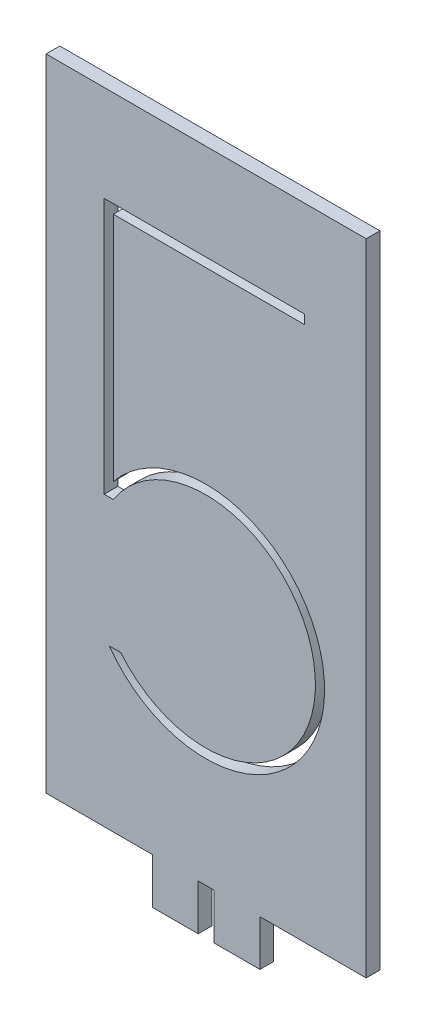
ISO-10303-21;
HEADER;
FILE_DESCRIPTION(('STEP AP214'),'2;1');
FILE_NAME('part.step','',(''),(''),'','','');
FILE_SCHEMA(('AUTOMOTIVE_DESIGN { 1 0 10303 214 1 1 1 1 }'));
ENDSEC;
DATA;
#1=APPLICATION_CONTEXT('core data for automotive mechanical design processes');
#2=APPLICATION_PROTOCOL_DEFINITION('international standard','automotive_design',2000,#1);
#3=PRODUCT_CONTEXT('',#1,'mechanical');
#4=PRODUCT('Part','Part','',(#3));
#5=PRODUCT_RELATED_PRODUCT_CATEGORY('part','',(#4));
#6=PRODUCT_DEFINITION_FORMATION('','',#4);
#7=PRODUCT_DEFINITION_CONTEXT('part definition',#1,'design');
#8=PRODUCT_DEFINITION('design','',#6,#7);
#9=PRODUCT_DEFINITION_SHAPE('','',#8);
#10=(LENGTH_UNIT() NAMED_UNIT(*) SI_UNIT(.MILLI.,.METRE.));
#11=(NAMED_UNIT(*) PLANE_ANGLE_UNIT() SI_UNIT($,.RADIAN.));
#12=(NAMED_UNIT(*) SI_UNIT($,.STERADIAN.) SOLID_ANGLE_UNIT());
#13=UNCERTAINTY_MEASURE_WITH_UNIT(LENGTH_MEASURE(1.E-05),#10,'distance_accuracy_value','');
#14=(GEOMETRIC_REPRESENTATION_CONTEXT(3) GLOBAL_UNCERTAINTY_ASSIGNED_CONTEXT((#13)) GLOBAL_UNIT_ASSIGNED_CONTEXT((#10,
#11,#12)) REPRESENTATION_CONTEXT('',''));
#15=CARTESIAN_POINT('',(0.,0.,0.));
#16=DIRECTION('',(0.,0.,1.));
#17=DIRECTION('',(1.,0.,0.));
#18=AXIS2_PLACEMENT_3D('',#15,#16,#17);
#19=CARTESIAN_POINT('',(0.,0.,1.5));
#20=DIRECTION('',(0.,1.,0.));
#21=DIRECTION('',(0.,0.,1.));
#22=AXIS2_PLACEMENT_3D('',#19,#20,#21);
#23=PLANE('',#22);
#24=DIRECTION('',(1.,0.,0.));
#25=VECTOR('',#24,1.);
#26=CARTESIAN_POINT('',(0.,0.,1.5));
#27=LINE('',#26,#25);
#28=CARTESIAN_POINT('',(11.63,0.,1.5));
#29=VERTEX_POINT('',#28);
#30=CARTESIAN_POINT('',(16.63,0.,1.5));
#31=VERTEX_POINT('',#30);
#32=EDGE_CURVE('E362',#29,#31,#27,.T.);
#33=ORIENTED_EDGE('',*,*,#32,.F.);
#34=DIRECTION('',(0.,0.,1.));
#35=VECTOR('',#34,1.);
#36=CARTESIAN_POINT('',(11.63,0.,0.));
#37=LINE('',#36,#35);
#38=CARTESIAN_POINT('',(11.63,0.,0.));
#39=VERTEX_POINT('',#38);
#40=EDGE_CURVE('E278',#39,#29,#37,.T.);
#41=ORIENTED_EDGE('',*,*,#40,.F.);
#42=DIRECTION('',(1.,0.,0.));
#43=VECTOR('',#42,1.);
#44=CARTESIAN_POINT('',(0.,0.,0.));
#45=LINE('',#44,#43);
#46=CARTESIAN_POINT('',(16.63,0.,0.));
#47=VERTEX_POINT('',#46);
#48=EDGE_CURVE('E377',#39,#47,#45,.T.);
#49=ORIENTED_EDGE('',*,*,#48,.T.);
#50=DIRECTION('',(0.,0.,1.));
#51=VECTOR('',#50,1.);
#52=CARTESIAN_POINT('',(16.63,0.,0.));
#53=LINE('',#52,#51);
#54=EDGE_CURVE('E332',#47,#31,#53,.T.);
#55=ORIENTED_EDGE('',*,*,#54,.T.);
#56=EDGE_LOOP('',(#33,#41,#49,#55));
#57=FACE_BOUND('',#56,.T.);
#58=ADVANCED_FACE('F39',(#57),#23,.F.);
#59=CARTESIAN_POINT('',(0.,0.,1.5));
#60=DIRECTION('',(1.,0.,0.));
#61=DIRECTION('',(0.,1.,0.));
#62=AXIS2_PLACEMENT_3D('',#59,#60,#61);
#63=PLANE('',#62);
#64=DIRECTION('',(0.,-1.,0.));
#65=VECTOR('',#64,1.);
#66=CARTESIAN_POINT('',(0.,0.,0.));
#67=LINE('',#66,#65);
#68=CARTESIAN_POINT('',(0.,75.,0.));
#69=VERTEX_POINT('',#68);
#70=CARTESIAN_POINT('',(0.,5.,0.));
#71=VERTEX_POINT('',#70);
#72=EDGE_CURVE('E290',#69,#71,#67,.T.);
#73=ORIENTED_EDGE('',*,*,#72,.T.);
#74=DIRECTION('',(0.,0.,1.));
#75=VECTOR('',#74,1.);
#76=CARTESIAN_POINT('',(0.,5.,0.));
#77=LINE('',#76,#75);
#78=CARTESIAN_POINT('',(0.,5.,1.5));
#79=VERTEX_POINT('',#78);
#80=EDGE_CURVE('E286',#71,#79,#77,.T.);
#81=ORIENTED_EDGE('',*,*,#80,.T.);
#82=DIRECTION('',(0.,-1.,0.));
#83=VECTOR('',#82,1.);
#84=CARTESIAN_POINT('',(0.,0.,1.5));
#85=LINE('',#84,#83);
#86=CARTESIAN_POINT('',(0.,75.,1.5));
#87=VERTEX_POINT('',#86);
#88=EDGE_CURVE('E353',#87,#79,#85,.T.);
#89=ORIENTED_EDGE('',*,*,#88,.F.);
#90=DIRECTION('',(0.,0.,-1.));
#91=VECTOR('',#90,1.);
#92=CARTESIAN_POINT('',(0.,75.,1.5));
#93=LINE('',#92,#91);
#94=EDGE_CURVE('E369',#87,#69,#93,.T.);
#95=ORIENTED_EDGE('',*,*,#94,.T.);
#96=EDGE_LOOP('',(#73,#81,#89,#95));
#97=FACE_BOUND('',#96,.T.);
#98=ADVANCED_FACE('F41',(#97),#63,.F.);
#99=CARTESIAN_POINT('',(18.38,0.,0.));
#100=VERTEX_POINT('',#99);
#101=CARTESIAN_POINT('',(23.38,0.,0.));
#102=VERTEX_POINT('',#101);
#103=EDGE_CURVE('E373',#100,#102,#45,.T.);
#104=ORIENTED_EDGE('',*,*,#103,.T.);
#105=DIRECTION('',(0.,0.,1.));
#106=VECTOR('',#105,1.);
#107=CARTESIAN_POINT('',(23.38,0.,0.));
#108=LINE('',#107,#106);
#109=CARTESIAN_POINT('',(23.38,0.,1.5));
#110=VERTEX_POINT('',#109);
#111=EDGE_CURVE('E303',#102,#110,#108,.T.);
#112=ORIENTED_EDGE('',*,*,#111,.T.);
#113=CARTESIAN_POINT('',(18.38,0.,1.5));
#114=VERTEX_POINT('',#113);
#115=EDGE_CURVE('E357',#114,#110,#27,.T.);
#116=ORIENTED_EDGE('',*,*,#115,.F.);
#117=DIRECTION('',(0.,0.,1.));
#118=VECTOR('',#117,1.);
#119=CARTESIAN_POINT('',(18.38,0.,0.));
#120=LINE('',#119,#118);
#121=EDGE_CURVE('E347',#100,#114,#120,.T.);
#122=ORIENTED_EDGE('',*,*,#121,.F.);
#123=EDGE_LOOP('',(#104,#112,#116,#122));
#124=FACE_BOUND('',#123,.T.);
#125=ADVANCED_FACE('F446',(#124),#23,.F.);
#126=CARTESIAN_POINT('',(35.,0.,1.5));
#127=DIRECTION('',(-1.,0.,0.));
#128=DIRECTION('',(0.,-1.,0.));
#129=AXIS2_PLACEMENT_3D('',#126,#127,#128);
#130=PLANE('',#129);
#131=DIRECTION('',(0.,1.,0.));
#132=VECTOR('',#131,1.);
#133=CARTESIAN_POINT('',(35.,0.,1.5));
#134=LINE('',#133,#132);
#135=CARTESIAN_POINT('',(35.,5.,1.5));
#136=VERTEX_POINT('',#135);
#137=CARTESIAN_POINT('',(35.,75.,1.5));
#138=VERTEX_POINT('',#137);
#139=EDGE_CURVE('E363',#136,#138,#134,.T.);
#140=ORIENTED_EDGE('',*,*,#139,.F.);
#141=DIRECTION('',(0.,0.,1.));
#142=VECTOR('',#141,1.);
#143=CARTESIAN_POINT('',(35.,5.,0.));
#144=LINE('',#143,#142);
#145=CARTESIAN_POINT('',(35.,5.,0.));
#146=VERTEX_POINT('',#145);
#147=EDGE_CURVE('E313',#146,#136,#144,.T.);
#148=ORIENTED_EDGE('',*,*,#147,.F.);
#149=DIRECTION('',(0.,1.,0.));
#150=VECTOR('',#149,1.);
#151=CARTESIAN_POINT('',(35.,0.,0.));
#152=LINE('',#151,#150);
#153=CARTESIAN_POINT('',(35.,75.,0.));
#154=VERTEX_POINT('',#153);
#155=EDGE_CURVE('E378',#146,#154,#152,.T.);
#156=ORIENTED_EDGE('',*,*,#155,.T.);
#157=DIRECTION('',(0.,0.,-1.));
#158=VECTOR('',#157,1.);
#159=CARTESIAN_POINT('',(35.,75.,1.5));
#160=LINE('',#159,#158);
#161=EDGE_CURVE('E386',#138,#154,#160,.T.);
#162=ORIENTED_EDGE('',*,*,#161,.F.);
#163=EDGE_LOOP('',(#140,#148,#156,#162));
#164=FACE_BOUND('',#163,.T.);
#165=ADVANCED_FACE('F454',(#164),#130,.F.);
#166=CARTESIAN_POINT('',(0.,75.,1.5));
#167=DIRECTION('',(0.,-1.,0.));
#168=DIRECTION('',(0.,0.,-1.));
#169=AXIS2_PLACEMENT_3D('',#166,#167,#168);
#170=PLANE('',#169);
#171=DIRECTION('',(-1.,0.,0.));
#172=VECTOR('',#171,1.);
#173=CARTESIAN_POINT('',(0.,75.,0.));
#174=LINE('',#173,#172);
#175=EDGE_CURVE('E358',#154,#69,#174,.T.);
#176=ORIENTED_EDGE('',*,*,#175,.T.);
#177=ORIENTED_EDGE('',*,*,#94,.F.);
#178=DIRECTION('',(-1.,0.,0.));
#179=VECTOR('',#178,1.);
#180=CARTESIAN_POINT('',(0.,75.,1.5));
#181=LINE('',#180,#179);
#182=EDGE_CURVE('E366',#138,#87,#181,.T.);
#183=ORIENTED_EDGE('',*,*,#182,.F.);
#184=ORIENTED_EDGE('',*,*,#161,.T.);
#185=EDGE_LOOP('',(#176,#177,#183,#184));
#186=FACE_BOUND('',#185,.T.);
#187=ADVANCED_FACE('F459',(#186),#170,.F.);
#188=CARTESIAN_POINT('',(0.,0.,1.5));
#189=DIRECTION('',(0.,0.,-1.));
#190=DIRECTION('',(-1.,0.,0.));
#191=AXIS2_PLACEMENT_3D('',#188,#189,#190);
#192=PLANE('',#191);
#193=DIRECTION('',(1.,0.,0.));
#194=VECTOR('',#193,1.);
#195=CARTESIAN_POINT('',(7.35039959030423,63.5,1.5));
#196=LINE('',#195,#194);
#197=CARTESIAN_POINT('',(7.35039959030423,63.5,1.5));
#198=VERTEX_POINT('',#197);
#199=CARTESIAN_POINT('',(28.25,63.5,1.5));
#200=VERTEX_POINT('',#199);
#201=EDGE_CURVE('E187',#198,#200,#196,.T.);
#202=ORIENTED_EDGE('',*,*,#201,.F.);
#203=DIRECTION('',(0.,1.,0.));
#204=VECTOR('',#203,1.);
#205=CARTESIAN_POINT('',(7.35039959030423,36.4826841073414,1.5));
#206=LINE('',#205,#204);
#207=CARTESIAN_POINT('',(7.35039959030423,38.1868915490299,1.5));
#208=VERTEX_POINT('',#207);
#209=EDGE_CURVE('E198',#208,#198,#206,.T.);
#210=ORIENTED_EDGE('',*,*,#209,.F.);
#211=CARTESIAN_POINT('',(17.4486572006261,30.,1.5));
#212=DIRECTION('',(0.,0.,1.));
#213=DIRECTION('',(1.,0.,0.));
#214=AXIS2_PLACEMENT_3D('',#211,#212,#213);
#215=CIRCLE('',#214,13.);
#216=CARTESIAN_POINT('',(6.90262565731402,22.3986041619011,1.5));
#217=VERTEX_POINT('',#216);
#218=EDGE_CURVE('E249',#217,#208,#215,.T.);
#219=ORIENTED_EDGE('',*,*,#218,.F.);
#220=DIRECTION('',(-1.,0.,0.));
#221=VECTOR('',#220,1.);
#222=CARTESIAN_POINT('',(8.16325029987407,22.3986041619011,1.5));
#223=LINE('',#222,#221);
#224=CARTESIAN_POINT('',(8.16325029987407,22.3986041619011,1.5));
#225=VERTEX_POINT('',#224);
#226=EDGE_CURVE('E256',#225,#217,#223,.T.);
#227=ORIENTED_EDGE('',*,*,#226,.F.);
#228=CARTESIAN_POINT('',(17.4486572006261,30.,1.5));
#229=DIRECTION('',(0.,0.,-1.));
#230=DIRECTION('',(1.,0.,0.));
#231=AXIS2_PLACEMENT_3D('',#228,#229,#230);
#232=CIRCLE('',#231,12.);
#233=CARTESIAN_POINT('',(7.35039959030423,36.4826841073414,1.5));
#234=VERTEX_POINT('',#233);
#235=EDGE_CURVE('E252',#234,#225,#232,.T.);
#236=ORIENTED_EDGE('',*,*,#235,.F.);
#237=DIRECTION('',(1.,0.,0.));
#238=VECTOR('',#237,1.);
#239=CARTESIAN_POINT('',(7.35039959030423,36.4826841073414,1.5));
#240=LINE('',#239,#238);
#241=CARTESIAN_POINT('',(6.35039959030423,36.4826841073414,1.5));
#242=VERTEX_POINT('',#241);
#243=EDGE_CURVE('E195',#242,#234,#240,.T.);
#244=ORIENTED_EDGE('',*,*,#243,.F.);
#245=DIRECTION('',(0.,-1.,0.));
#246=VECTOR('',#245,1.);
#247=CARTESIAN_POINT('',(6.35039959030423,36.4826841073414,1.5));
#248=LINE('',#247,#246);
#249=CARTESIAN_POINT('',(6.35039959030423,64.5,1.5));
#250=VERTEX_POINT('',#249);
#251=EDGE_CURVE('E221',#250,#242,#248,.T.);
#252=ORIENTED_EDGE('',*,*,#251,.F.);
#253=DIRECTION('',(-1.,0.,0.));
#254=VECTOR('',#253,1.);
#255=CARTESIAN_POINT('',(7.35039959030423,64.5,1.5));
#256=LINE('',#255,#254);
#257=CARTESIAN_POINT('',(28.25,64.5,1.5));
#258=VERTEX_POINT('',#257);
#259=EDGE_CURVE('E215',#258,#250,#256,.T.);
#260=ORIENTED_EDGE('',*,*,#259,.F.);
#261=DIRECTION('',(0.,1.,0.));
#262=VECTOR('',#261,1.);
#263=CARTESIAN_POINT('',(28.25,64.5,1.5));
#264=LINE('',#263,#262);
#265=EDGE_CURVE('E211',#200,#258,#264,.T.);
#266=ORIENTED_EDGE('',*,*,#265,.F.);
#267=EDGE_LOOP('',(#202,#210,#219,#227,#236,#244,#252,#260,#266));
#268=FACE_BOUND('',#267,.T.);
#269=ORIENTED_EDGE('',*,*,#88,.T.);
#270=DIRECTION('',(-1.,0.,0.));
#271=VECTOR('',#270,1.);
#272=CARTESIAN_POINT('',(0.,5.,1.5));
#273=LINE('',#272,#271);
#274=CARTESIAN_POINT('',(11.63,5.,1.5));
#275=VERTEX_POINT('',#274);
#276=EDGE_CURVE('E275',#275,#79,#273,.T.);
#277=ORIENTED_EDGE('',*,*,#276,.F.);
#278=DIRECTION('',(0.,1.,0.));
#279=VECTOR('',#278,1.);
#280=CARTESIAN_POINT('',(11.63,0.,1.5));
#281=LINE('',#280,#279);
#282=EDGE_CURVE('E279',#29,#275,#281,.T.);
#283=ORIENTED_EDGE('',*,*,#282,.F.);
#284=ORIENTED_EDGE('',*,*,#32,.T.);
#285=DIRECTION('',(0.,-1.,0.));
#286=VECTOR('',#285,1.);
#287=CARTESIAN_POINT('',(16.63,0.,1.5));
#288=LINE('',#287,#286);
#289=CARTESIAN_POINT('',(16.63,5.,1.5));
#290=VERTEX_POINT('',#289);
#291=EDGE_CURVE('E264',#290,#31,#288,.T.);
#292=ORIENTED_EDGE('',*,*,#291,.F.);
#293=DIRECTION('',(-1.,0.,0.));
#294=VECTOR('',#293,1.);
#295=CARTESIAN_POINT('',(16.63,5.,1.5));
#296=LINE('',#295,#294);
#297=CARTESIAN_POINT('',(18.38,5.,1.5));
#298=VERTEX_POINT('',#297);
#299=EDGE_CURVE('E324',#298,#290,#296,.T.);
#300=ORIENTED_EDGE('',*,*,#299,.F.);
#301=DIRECTION('',(0.,1.,0.));
#302=VECTOR('',#301,1.);
#303=CARTESIAN_POINT('',(18.38,0.,1.5));
#304=LINE('',#303,#302);
#305=EDGE_CURVE('E335',#114,#298,#304,.T.);
#306=ORIENTED_EDGE('',*,*,#305,.F.);
#307=ORIENTED_EDGE('',*,*,#115,.T.);
#308=DIRECTION('',(0.,-1.,0.));
#309=VECTOR('',#308,1.);
#310=CARTESIAN_POINT('',(23.38,5.,1.5));
#311=LINE('',#310,#309);
#312=CARTESIAN_POINT('',(23.38,5.,1.5));
#313=VERTEX_POINT('',#312);
#314=EDGE_CURVE('E304',#313,#110,#311,.T.);
#315=ORIENTED_EDGE('',*,*,#314,.F.);
#316=DIRECTION('',(-1.,0.,0.));
#317=VECTOR('',#316,1.);
#318=CARTESIAN_POINT('',(23.38,5.,1.5));
#319=LINE('',#318,#317);
#320=EDGE_CURVE('E299',#136,#313,#319,.T.);
#321=ORIENTED_EDGE('',*,*,#320,.F.);
#322=ORIENTED_EDGE('',*,*,#139,.T.);
#323=ORIENTED_EDGE('',*,*,#182,.T.);
#324=EDGE_LOOP('',(#269,#277,#283,#284,#292,#300,#306,#307,#315,#321,#322,#323));
#325=FACE_BOUND('',#324,.T.);
#326=ADVANCED_FACE('F207',(#268,#325),#192,.F.);
#327=CARTESIAN_POINT('',(0.,0.,0.));
#328=DIRECTION('',(0.,0.,-1.));
#329=DIRECTION('',(-1.,0.,0.));
#330=AXIS2_PLACEMENT_3D('',#327,#328,#329);
#331=PLANE('',#330);
#332=DIRECTION('',(0.,-1.,0.));
#333=VECTOR('',#332,1.);
#334=CARTESIAN_POINT('',(7.35039959030423,0.,0.));
#335=LINE('',#334,#333);
#336=CARTESIAN_POINT('',(7.35039959030423,63.5,0.));
#337=VERTEX_POINT('',#336);
#338=CARTESIAN_POINT('',(7.35039959030423,38.1868915490299,0.));
#339=VERTEX_POINT('',#338);
#340=EDGE_CURVE('E246',#337,#339,#335,.T.);
#341=ORIENTED_EDGE('',*,*,#340,.F.);
#342=DIRECTION('',(-1.,0.,0.));
#343=VECTOR('',#342,1.);
#344=CARTESIAN_POINT('',(0.,63.5,0.));
#345=LINE('',#344,#343);
#346=CARTESIAN_POINT('',(28.25,63.5,0.));
#347=VERTEX_POINT('',#346);
#348=EDGE_CURVE('E190',#347,#337,#345,.T.);
#349=ORIENTED_EDGE('',*,*,#348,.F.);
#350=DIRECTION('',(0.,-1.,0.));
#351=VECTOR('',#350,1.);
#352=CARTESIAN_POINT('',(28.25,0.,0.));
#353=LINE('',#352,#351);
#354=CARTESIAN_POINT('',(28.25,64.5,0.));
#355=VERTEX_POINT('',#354);
#356=EDGE_CURVE('E48',#355,#347,#353,.T.);
#357=ORIENTED_EDGE('',*,*,#356,.F.);
#358=DIRECTION('',(1.,0.,0.));
#359=VECTOR('',#358,1.);
#360=CARTESIAN_POINT('',(0.,64.5,0.));
#361=LINE('',#360,#359);
#362=CARTESIAN_POINT('',(6.35039959030423,64.5,0.));
#363=VERTEX_POINT('',#362);
#364=EDGE_CURVE('E11',#363,#355,#361,.T.);
#365=ORIENTED_EDGE('',*,*,#364,.F.);
#366=DIRECTION('',(0.,1.,0.));
#367=VECTOR('',#366,1.);
#368=CARTESIAN_POINT('',(6.35039959030422,0.,0.));
#369=LINE('',#368,#367);
#370=CARTESIAN_POINT('',(6.35039959030423,36.4826841073414,0.));
#371=VERTEX_POINT('',#370);
#372=EDGE_CURVE('E230',#371,#363,#369,.T.);
#373=ORIENTED_EDGE('',*,*,#372,.F.);
#374=DIRECTION('',(-1.,0.,0.));
#375=VECTOR('',#374,1.);
#376=CARTESIAN_POINT('',(0.,36.4826841073414,0.));
#377=LINE('',#376,#375);
#378=CARTESIAN_POINT('',(7.35039959030423,36.4826841073414,0.));
#379=VERTEX_POINT('',#378);
#380=EDGE_CURVE('E241',#379,#371,#377,.T.);
#381=ORIENTED_EDGE('',*,*,#380,.F.);
#382=CARTESIAN_POINT('',(17.4486572006261,30.,0.));
#383=DIRECTION('',(0.,0.,-1.));
#384=DIRECTION('',(-1.,0.,0.));
#385=AXIS2_PLACEMENT_3D('',#382,#383,#384);
#386=CIRCLE('',#385,12.);
#387=CARTESIAN_POINT('',(8.16325029987407,22.3986041619011,0.));
#388=VERTEX_POINT('',#387);
#389=EDGE_CURVE('E390',#388,#379,#386,.F.);
#390=ORIENTED_EDGE('',*,*,#389,.F.);
#391=DIRECTION('',(1.,0.,0.));
#392=VECTOR('',#391,1.);
#393=CARTESIAN_POINT('',(0.,22.3986041619011,0.));
#394=LINE('',#393,#392);
#395=CARTESIAN_POINT('',(6.90262565731402,22.3986041619011,0.));
#396=VERTEX_POINT('',#395);
#397=EDGE_CURVE('E394',#396,#388,#394,.T.);
#398=ORIENTED_EDGE('',*,*,#397,.F.);
#399=CARTESIAN_POINT('',(17.4486572006261,30.,0.));
#400=DIRECTION('',(0.,0.,-1.));
#401=DIRECTION('',(-1.,0.,0.));
#402=AXIS2_PLACEMENT_3D('',#399,#400,#401);
#403=CIRCLE('',#402,13.);
#404=EDGE_CURVE('E397',#339,#396,#403,.T.);
#405=ORIENTED_EDGE('',*,*,#404,.F.);
#406=EDGE_LOOP('',(#341,#349,#357,#365,#373,#381,#390,#398,#405));
#407=FACE_BOUND('',#406,.T.);
#408=DIRECTION('',(-1.,0.,0.));
#409=VECTOR('',#408,1.);
#410=CARTESIAN_POINT('',(0.,5.,0.));
#411=LINE('',#410,#409);
#412=CARTESIAN_POINT('',(11.63,5.,0.));
#413=VERTEX_POINT('',#412);
#414=EDGE_CURVE('E55',#413,#71,#411,.T.);
#415=ORIENTED_EDGE('',*,*,#414,.T.);
#416=ORIENTED_EDGE('',*,*,#72,.F.);
#417=ORIENTED_EDGE('',*,*,#175,.F.);
#418=ORIENTED_EDGE('',*,*,#155,.F.);
#419=DIRECTION('',(-1.,0.,0.));
#420=VECTOR('',#419,1.);
#421=CARTESIAN_POINT('',(23.38,5.,0.));
#422=LINE('',#421,#420);
#423=CARTESIAN_POINT('',(23.38,5.,0.));
#424=VERTEX_POINT('',#423);
#425=EDGE_CURVE('E298',#146,#424,#422,.T.);
#426=ORIENTED_EDGE('',*,*,#425,.T.);
#427=DIRECTION('',(0.,-1.,0.));
#428=VECTOR('',#427,1.);
#429=CARTESIAN_POINT('',(23.38,5.,0.));
#430=LINE('',#429,#428);
#431=EDGE_CURVE('E63',#424,#102,#430,.T.);
#432=ORIENTED_EDGE('',*,*,#431,.T.);
#433=ORIENTED_EDGE('',*,*,#103,.F.);
#434=DIRECTION('',(0.,1.,0.));
#435=VECTOR('',#434,1.);
#436=CARTESIAN_POINT('',(18.38,0.,0.));
#437=LINE('',#436,#435);
#438=CARTESIAN_POINT('',(18.38,5.,0.));
#439=VERTEX_POINT('',#438);
#440=EDGE_CURVE('E323',#100,#439,#437,.T.);
#441=ORIENTED_EDGE('',*,*,#440,.T.);
#442=DIRECTION('',(-1.,0.,0.));
#443=VECTOR('',#442,1.);
#444=CARTESIAN_POINT('',(16.63,5.,0.));
#445=LINE('',#444,#443);
#446=CARTESIAN_POINT('',(16.63,5.,0.));
#447=VERTEX_POINT('',#446);
#448=EDGE_CURVE('E328',#439,#447,#445,.T.);
#449=ORIENTED_EDGE('',*,*,#448,.T.);
#450=DIRECTION('',(0.,-1.,0.));
#451=VECTOR('',#450,1.);
#452=CARTESIAN_POINT('',(16.63,0.,0.));
#453=LINE('',#452,#451);
#454=EDGE_CURVE('E319',#447,#47,#453,.T.);
#455=ORIENTED_EDGE('',*,*,#454,.T.);
#456=ORIENTED_EDGE('',*,*,#48,.F.);
#457=DIRECTION('',(0.,1.,0.));
#458=VECTOR('',#457,1.);
#459=CARTESIAN_POINT('',(11.63,0.,0.));
#460=LINE('',#459,#458);
#461=EDGE_CURVE('E271',#39,#413,#460,.T.);
#462=ORIENTED_EDGE('',*,*,#461,.T.);
#463=EDGE_LOOP('',(#415,#416,#417,#418,#426,#432,#433,#441,#449,#455,#456,#462));
#464=FACE_BOUND('',#463,.T.);
#465=ADVANCED_FACE('F408',(#407,#464),#331,.T.);
#466=CARTESIAN_POINT('',(16.63,0.,0.));
#467=DIRECTION('',(-1.,0.,0.));
#468=DIRECTION('',(0.,0.,1.));
#469=AXIS2_PLACEMENT_3D('',#466,#467,#468);
#470=PLANE('',#469);
#471=ORIENTED_EDGE('',*,*,#291,.T.);
#472=ORIENTED_EDGE('',*,*,#54,.F.);
#473=ORIENTED_EDGE('',*,*,#454,.F.);
#474=DIRECTION('',(0.,0.,1.));
#475=VECTOR('',#474,1.);
#476=CARTESIAN_POINT('',(16.63,5.,0.));
#477=LINE('',#476,#475);
#478=EDGE_CURVE('E307',#447,#290,#477,.T.);
#479=ORIENTED_EDGE('',*,*,#478,.T.);
#480=EDGE_LOOP('',(#471,#472,#473,#479));
#481=FACE_BOUND('',#480,.T.);
#482=ADVANCED_FACE('F492',(#481),#470,.F.);
#483=CARTESIAN_POINT('',(16.63,5.,0.));
#484=DIRECTION('',(0.,1.,0.));
#485=DIRECTION('',(0.,0.,1.));
#486=AXIS2_PLACEMENT_3D('',#483,#484,#485);
#487=PLANE('',#486);
#488=ORIENTED_EDGE('',*,*,#299,.T.);
#489=ORIENTED_EDGE('',*,*,#478,.F.);
#490=ORIENTED_EDGE('',*,*,#448,.F.);
#491=DIRECTION('',(0.,0.,1.));
#492=VECTOR('',#491,1.);
#493=CARTESIAN_POINT('',(18.38,5.,0.));
#494=LINE('',#493,#492);
#495=EDGE_CURVE('E344',#439,#298,#494,.T.);
#496=ORIENTED_EDGE('',*,*,#495,.T.);
#497=EDGE_LOOP('',(#488,#489,#490,#496));
#498=FACE_BOUND('',#497,.T.);
#499=ADVANCED_FACE('F486',(#498),#487,.F.);
#500=CARTESIAN_POINT('',(18.38,0.,0.));
#501=DIRECTION('',(1.,0.,0.));
#502=DIRECTION('',(0.,0.,-1.));
#503=AXIS2_PLACEMENT_3D('',#500,#501,#502);
#504=PLANE('',#503);
#505=ORIENTED_EDGE('',*,*,#305,.T.);
#506=ORIENTED_EDGE('',*,*,#495,.F.);
#507=ORIENTED_EDGE('',*,*,#440,.F.);
#508=ORIENTED_EDGE('',*,*,#121,.T.);
#509=EDGE_LOOP('',(#505,#506,#507,#508));
#510=FACE_BOUND('',#509,.T.);
#511=ADVANCED_FACE('F478',(#510),#504,.F.);
#512=CARTESIAN_POINT('',(23.38,5.,0.));
#513=DIRECTION('',(-1.,0.,0.));
#514=DIRECTION('',(0.,0.,1.));
#515=AXIS2_PLACEMENT_3D('',#512,#513,#514);
#516=PLANE('',#515);
#517=ORIENTED_EDGE('',*,*,#314,.T.);
#518=ORIENTED_EDGE('',*,*,#111,.F.);
#519=ORIENTED_EDGE('',*,*,#431,.F.);
#520=DIRECTION('',(0.,0.,1.));
#521=VECTOR('',#520,1.);
#522=CARTESIAN_POINT('',(23.38,5.,0.));
#523=LINE('',#522,#521);
#524=EDGE_CURVE('E283',#424,#313,#523,.T.);
#525=ORIENTED_EDGE('',*,*,#524,.T.);
#526=EDGE_LOOP('',(#517,#518,#519,#525));
#527=FACE_BOUND('',#526,.T.);
#528=ADVANCED_FACE('F476',(#527),#516,.F.);
#529=CARTESIAN_POINT('',(23.38,5.,0.));
#530=DIRECTION('',(0.,1.,0.));
#531=DIRECTION('',(0.,0.,1.));
#532=AXIS2_PLACEMENT_3D('',#529,#530,#531);
#533=PLANE('',#532);
#534=ORIENTED_EDGE('',*,*,#320,.T.);
#535=ORIENTED_EDGE('',*,*,#524,.F.);
#536=ORIENTED_EDGE('',*,*,#425,.F.);
#537=ORIENTED_EDGE('',*,*,#147,.T.);
#538=EDGE_LOOP('',(#534,#535,#536,#537));
#539=FACE_BOUND('',#538,.T.);
#540=ADVANCED_FACE('F468',(#539),#533,.F.);
#541=CARTESIAN_POINT('',(0.,5.,0.));
#542=DIRECTION('',(0.,1.,0.));
#543=DIRECTION('',(0.,0.,1.));
#544=AXIS2_PLACEMENT_3D('',#541,#542,#543);
#545=PLANE('',#544);
#546=ORIENTED_EDGE('',*,*,#276,.T.);
#547=ORIENTED_EDGE('',*,*,#80,.F.);
#548=ORIENTED_EDGE('',*,*,#414,.F.);
#549=DIRECTION('',(0.,0.,1.));
#550=VECTOR('',#549,1.);
#551=CARTESIAN_POINT('',(11.63,5.,0.));
#552=LINE('',#551,#550);
#553=EDGE_CURVE('E291',#413,#275,#552,.T.);
#554=ORIENTED_EDGE('',*,*,#553,.T.);
#555=EDGE_LOOP('',(#546,#547,#548,#554));
#556=FACE_BOUND('',#555,.T.);
#557=ADVANCED_FACE('F484',(#556),#545,.F.);
#558=CARTESIAN_POINT('',(11.63,0.,0.));
#559=DIRECTION('',(1.,0.,0.));
#560=DIRECTION('',(0.,1.,0.));
#561=AXIS2_PLACEMENT_3D('',#558,#559,#560);
#562=PLANE('',#561);
#563=ORIENTED_EDGE('',*,*,#282,.T.);
#564=ORIENTED_EDGE('',*,*,#553,.F.);
#565=ORIENTED_EDGE('',*,*,#461,.F.);
#566=ORIENTED_EDGE('',*,*,#40,.T.);
#567=EDGE_LOOP('',(#563,#564,#565,#566));
#568=FACE_BOUND('',#567,.T.);
#569=ADVANCED_FACE('F512',(#568),#562,.F.);
#570=CARTESIAN_POINT('',(17.4486572006261,30.,-18.5));
#571=DIRECTION('',(0.,0.,1.));
#572=DIRECTION('',(1.,0.,0.));
#573=AXIS2_PLACEMENT_3D('',#570,#571,#572);
#574=CYLINDRICAL_SURFACE('',#573,13.);
#575=ORIENTED_EDGE('',*,*,#218,.T.);
#576=DIRECTION('',(0.,0.,1.));
#577=VECTOR('',#576,1.);
#578=CARTESIAN_POINT('',(7.35039959030423,38.1868915490299,-18.5));
#579=LINE('',#578,#577);
#580=EDGE_CURVE('E201',#208,#339,#579,.F.);
#581=ORIENTED_EDGE('',*,*,#580,.T.);
#582=ORIENTED_EDGE('',*,*,#404,.T.);
#583=DIRECTION('',(0.,0.,1.));
#584=VECTOR('',#583,1.);
#585=CARTESIAN_POINT('',(6.90262565731402,22.3986041619011,-18.5));
#586=LINE('',#585,#584);
#587=EDGE_CURVE('E261',#396,#217,#586,.T.);
#588=ORIENTED_EDGE('',*,*,#587,.T.);
#589=EDGE_LOOP('',(#575,#581,#582,#588));
#590=FACE_BOUND('',#589,.T.);
#591=ADVANCED_FACE('F413',(#590),#574,.F.);
#592=CARTESIAN_POINT('',(8.16325029987407,22.3986041619011,-18.5));
#593=DIRECTION('',(0.,1.,0.));
#594=DIRECTION('',(0.,0.,1.));
#595=AXIS2_PLACEMENT_3D('',#592,#593,#594);
#596=PLANE('',#595);
#597=ORIENTED_EDGE('',*,*,#397,.T.);
#598=DIRECTION('',(0.,0.,1.));
#599=VECTOR('',#598,1.);
#600=CARTESIAN_POINT('',(8.16325029987407,22.3986041619011,-18.5));
#601=LINE('',#600,#599);
#602=EDGE_CURVE('E265',#388,#225,#601,.T.);
#603=ORIENTED_EDGE('',*,*,#602,.T.);
#604=ORIENTED_EDGE('',*,*,#226,.T.);
#605=ORIENTED_EDGE('',*,*,#587,.F.);
#606=EDGE_LOOP('',(#597,#603,#604,#605));
#607=FACE_BOUND('',#606,.T.);
#608=ADVANCED_FACE('F419',(#607),#596,.F.);
#609=CARTESIAN_POINT('',(17.4486572006261,30.,-18.5));
#610=DIRECTION('',(0.,0.,1.));
#611=DIRECTION('',(1.,0.,0.));
#612=AXIS2_PLACEMENT_3D('',#609,#610,#611);
#613=CYLINDRICAL_SURFACE('',#612,12.);
#614=ORIENTED_EDGE('',*,*,#389,.T.);
#615=DIRECTION('',(0.,0.,1.));
#616=VECTOR('',#615,1.);
#617=CARTESIAN_POINT('',(7.35039959030423,36.4826841073414,-18.5));
#618=LINE('',#617,#616);
#619=EDGE_CURVE('E260',#379,#234,#618,.T.);
#620=ORIENTED_EDGE('',*,*,#619,.T.);
#621=ORIENTED_EDGE('',*,*,#235,.T.);
#622=ORIENTED_EDGE('',*,*,#602,.F.);
#623=EDGE_LOOP('',(#614,#620,#621,#622));
#624=FACE_BOUND('',#623,.T.);
#625=ADVANCED_FACE('F423',(#624),#613,.T.);
#626=CARTESIAN_POINT('',(6.35039959030423,36.4826841073414,-18.5));
#627=DIRECTION('',(-1.,0.,0.));
#628=DIRECTION('',(0.,-1.,0.));
#629=AXIS2_PLACEMENT_3D('',#626,#627,#628);
#630=PLANE('',#629);
#631=ORIENTED_EDGE('',*,*,#372,.T.);
#632=DIRECTION('',(0.,0.,1.));
#633=VECTOR('',#632,1.);
#634=CARTESIAN_POINT('',(6.35039959030423,64.5,-18.5));
#635=LINE('',#634,#633);
#636=EDGE_CURVE('E231',#363,#250,#635,.T.);
#637=ORIENTED_EDGE('',*,*,#636,.T.);
#638=ORIENTED_EDGE('',*,*,#251,.T.);
#639=DIRECTION('',(0.,0.,1.));
#640=VECTOR('',#639,1.);
#641=CARTESIAN_POINT('',(6.35039959030423,36.4826841073414,-18.5));
#642=LINE('',#641,#640);
#643=EDGE_CURVE('E226',#371,#242,#642,.T.);
#644=ORIENTED_EDGE('',*,*,#643,.F.);
#645=EDGE_LOOP('',(#631,#637,#638,#644));
#646=FACE_BOUND('',#645,.T.);
#647=ADVANCED_FACE('F431',(#646),#630,.F.);
#648=CARTESIAN_POINT('',(7.35039959030423,36.4826841073414,-18.5));
#649=DIRECTION('',(1.,0.,0.));
#650=DIRECTION('',(0.,0.,-1.));
#651=AXIS2_PLACEMENT_3D('',#648,#649,#650);
#652=PLANE('',#651);
#653=ORIENTED_EDGE('',*,*,#340,.T.);
#654=ORIENTED_EDGE('',*,*,#580,.F.);
#655=ORIENTED_EDGE('',*,*,#209,.T.);
#656=DIRECTION('',(0.,0.,1.));
#657=VECTOR('',#656,1.);
#658=CARTESIAN_POINT('',(7.35039959030423,63.5,-18.5));
#659=LINE('',#658,#657);
#660=EDGE_CURVE('E182',#337,#198,#659,.T.);
#661=ORIENTED_EDGE('',*,*,#660,.F.);
#662=EDGE_LOOP('',(#653,#654,#655,#661));
#663=FACE_BOUND('',#662,.T.);
#664=ADVANCED_FACE('F199',(#663),#652,.F.);
#665=CARTESIAN_POINT('',(7.35039959030423,36.4826841073414,-18.5));
#666=DIRECTION('',(0.,-1.,0.));
#667=DIRECTION('',(0.,0.,-1.));
#668=AXIS2_PLACEMENT_3D('',#665,#666,#667);
#669=PLANE('',#668);
#670=ORIENTED_EDGE('',*,*,#380,.T.);
#671=ORIENTED_EDGE('',*,*,#643,.T.);
#672=ORIENTED_EDGE('',*,*,#243,.T.);
#673=ORIENTED_EDGE('',*,*,#619,.F.);
#674=EDGE_LOOP('',(#670,#671,#672,#673));
#675=FACE_BOUND('',#674,.T.);
#676=ADVANCED_FACE('F426',(#675),#669,.F.);
#677=CARTESIAN_POINT('',(7.35039959030423,64.5,-18.5));
#678=DIRECTION('',(0.,1.,0.));
#679=DIRECTION('',(0.,0.,1.));
#680=AXIS2_PLACEMENT_3D('',#677,#678,#679);
#681=PLANE('',#680);
#682=ORIENTED_EDGE('',*,*,#364,.T.);
#683=DIRECTION('',(0.,0.,1.));
#684=VECTOR('',#683,1.);
#685=CARTESIAN_POINT('',(28.25,64.5,-18.5));
#686=LINE('',#685,#684);
#687=EDGE_CURVE('E234',#355,#258,#686,.T.);
#688=ORIENTED_EDGE('',*,*,#687,.T.);
#689=ORIENTED_EDGE('',*,*,#259,.T.);
#690=ORIENTED_EDGE('',*,*,#636,.F.);
#691=EDGE_LOOP('',(#682,#688,#689,#690));
#692=FACE_BOUND('',#691,.T.);
#693=ADVANCED_FACE('F433',(#692),#681,.F.);
#694=CARTESIAN_POINT('',(28.25,64.5,-18.5));
#695=DIRECTION('',(1.,0.,0.));
#696=DIRECTION('',(0.,0.,-1.));
#697=AXIS2_PLACEMENT_3D('',#694,#695,#696);
#698=PLANE('',#697);
#699=ORIENTED_EDGE('',*,*,#356,.T.);
#700=DIRECTION('',(0.,0.,1.));
#701=VECTOR('',#700,1.);
#702=CARTESIAN_POINT('',(28.25,63.5,-18.5));
#703=LINE('',#702,#701);
#704=EDGE_CURVE('E194',#347,#200,#703,.T.);
#705=ORIENTED_EDGE('',*,*,#704,.T.);
#706=ORIENTED_EDGE('',*,*,#265,.T.);
#707=ORIENTED_EDGE('',*,*,#687,.F.);
#708=EDGE_LOOP('',(#699,#705,#706,#707));
#709=FACE_BOUND('',#708,.T.);
#710=ADVANCED_FACE('F405',(#709),#698,.F.);
#711=CARTESIAN_POINT('',(7.35039959030423,63.5,-18.5));
#712=DIRECTION('',(0.,-1.,0.));
#713=DIRECTION('',(0.,0.,-1.));
#714=AXIS2_PLACEMENT_3D('',#711,#712,#713);
#715=PLANE('',#714);
#716=ORIENTED_EDGE('',*,*,#348,.T.);
#717=ORIENTED_EDGE('',*,*,#660,.T.);
#718=ORIENTED_EDGE('',*,*,#201,.T.);
#719=ORIENTED_EDGE('',*,*,#704,.F.);
#720=EDGE_LOOP('',(#716,#717,#718,#719));
#721=FACE_BOUND('',#720,.T.);
#722=ADVANCED_FACE('F184',(#721),#715,.F.);
#723=CLOSED_SHELL('',(#58,#98,#125,#165,#187,#326,#465,#482,#499,#511,#528,#540,#557,#569,#591,
#608,#625,#647,#664,#676,#693,#710,#722));
#724=MANIFOLD_SOLID_BREP('B2',#723);
#725=ADVANCED_BREP_SHAPE_REPRESENTATION('',(#18,#724),#14);
#726=SHAPE_DEFINITION_REPRESENTATION(#9,#725);
ENDSEC;
END-ISO-10303-21;
